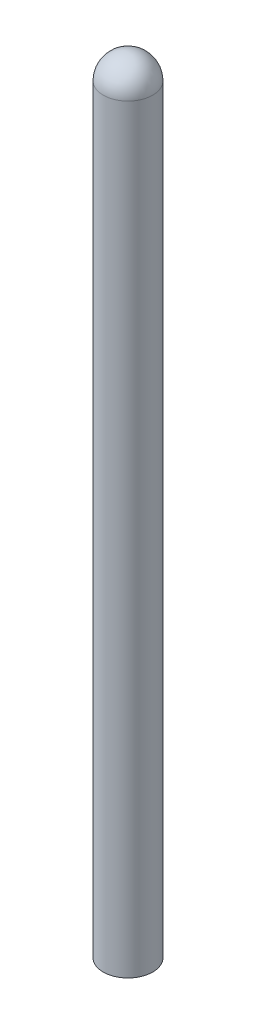
ISO-10303-21;
HEADER;
FILE_DESCRIPTION(('STEP AP214'),'2;1');
FILE_NAME('part.step','',(''),(''),'','','');
FILE_SCHEMA(('AUTOMOTIVE_DESIGN { 1 0 10303 214 1 1 1 1 }'));
ENDSEC;
DATA;
#1=APPLICATION_CONTEXT('core data for automotive mechanical design processes');
#2=APPLICATION_PROTOCOL_DEFINITION('international standard','automotive_design',2000,#1);
#3=PRODUCT_CONTEXT('',#1,'mechanical');
#4=PRODUCT('Part','Part','',(#3));
#5=PRODUCT_RELATED_PRODUCT_CATEGORY('part','',(#4));
#6=PRODUCT_DEFINITION_FORMATION('','',#4);
#7=PRODUCT_DEFINITION_CONTEXT('part definition',#1,'design');
#8=PRODUCT_DEFINITION('design','',#6,#7);
#9=PRODUCT_DEFINITION_SHAPE('','',#8);
#10=(LENGTH_UNIT() NAMED_UNIT(*) SI_UNIT(.MILLI.,.METRE.));
#11=(NAMED_UNIT(*) PLANE_ANGLE_UNIT() SI_UNIT($,.RADIAN.));
#12=(NAMED_UNIT(*) SI_UNIT($,.STERADIAN.) SOLID_ANGLE_UNIT());
#13=UNCERTAINTY_MEASURE_WITH_UNIT(LENGTH_MEASURE(1.E-05),#10,'distance_accuracy_value','');
#14=(GEOMETRIC_REPRESENTATION_CONTEXT(3) GLOBAL_UNCERTAINTY_ASSIGNED_CONTEXT((#13)) GLOBAL_UNIT_ASSIGNED_CONTEXT((#10,
#11,#12)) REPRESENTATION_CONTEXT('',''));
#15=CARTESIAN_POINT('',(0.,0.,0.));
#16=DIRECTION('',(0.,0.,1.));
#17=DIRECTION('',(1.,0.,0.));
#18=AXIS2_PLACEMENT_3D('',#15,#16,#17);
#19=CARTESIAN_POINT('',(0.,23.,0.));
#20=DIRECTION('',(0.,-1.,0.));
#21=DIRECTION('',(0.,0.,-1.));
#22=AXIS2_PLACEMENT_3D('',#19,#20,#21);
#23=CYLINDRICAL_SURFACE('',#22,0.75);
#24=CARTESIAN_POINT('',(0.,23.,0.));
#25=DIRECTION('',(0.,1.,0.));
#26=DIRECTION('',(0.,0.,1.));
#27=AXIS2_PLACEMENT_3D('',#24,#25,#26);
#28=CIRCLE('',#27,0.75);
#29=CARTESIAN_POINT('',(0.,23.,0.75));
#30=VERTEX_POINT('',#29);
#31=EDGE_CURVE('E10',#30,#30,#28,.T.);
#32=ORIENTED_EDGE('',*,*,#31,.F.);
#33=EDGE_LOOP('',(#32));
#34=FACE_BOUND('',#33,.T.);
#35=CARTESIAN_POINT('',(0.,0.,0.));
#36=DIRECTION('',(0.,1.,0.));
#37=DIRECTION('',(0.,0.,1.));
#38=AXIS2_PLACEMENT_3D('',#35,#36,#37);
#39=CIRCLE('',#38,0.75);
#40=CARTESIAN_POINT('',(0.,0.,0.75));
#41=VERTEX_POINT('',#40);
#42=EDGE_CURVE('E35',#41,#41,#39,.T.);
#43=ORIENTED_EDGE('',*,*,#42,.T.);
#44=EDGE_LOOP('',(#43));
#45=FACE_BOUND('',#44,.T.);
#46=ADVANCED_FACE('F32',(#34,#45),#23,.T.);
#47=CARTESIAN_POINT('',(0.,0.,0.));
#48=DIRECTION('',(0.,1.,0.));
#49=DIRECTION('',(0.,0.,1.));
#50=AXIS2_PLACEMENT_3D('',#47,#48,#49);
#51=PLANE('',#50);
#52=ORIENTED_EDGE('',*,*,#42,.F.);
#53=EDGE_LOOP('',(#52));
#54=FACE_BOUND('',#53,.T.);
#55=ADVANCED_FACE('F45',(#54),#51,.F.);
#56=CARTESIAN_POINT('',(0.,23.,0.));
#57=DIRECTION('',(0.,1.,0.));
#58=DIRECTION('',(0.,0.,-1.));
#59=AXIS2_PLACEMENT_3D('',#56,#57,#58);
#60=SPHERICAL_SURFACE('',#59,0.750000000000001);
#61=ORIENTED_EDGE('',*,*,#31,.T.);
#62=EDGE_LOOP('',(#61));
#63=FACE_BOUND('',#62,.T.);
#64=ADVANCED_FACE('F47',(#63),#60,.T.);
#65=CLOSED_SHELL('',(#46,#55,#64));
#66=MANIFOLD_SOLID_BREP('B2',#65);
#67=ADVANCED_BREP_SHAPE_REPRESENTATION('',(#18,#66),#14);
#68=SHAPE_DEFINITION_REPRESENTATION(#9,#67);
ENDSEC;
END-ISO-10303-21;
